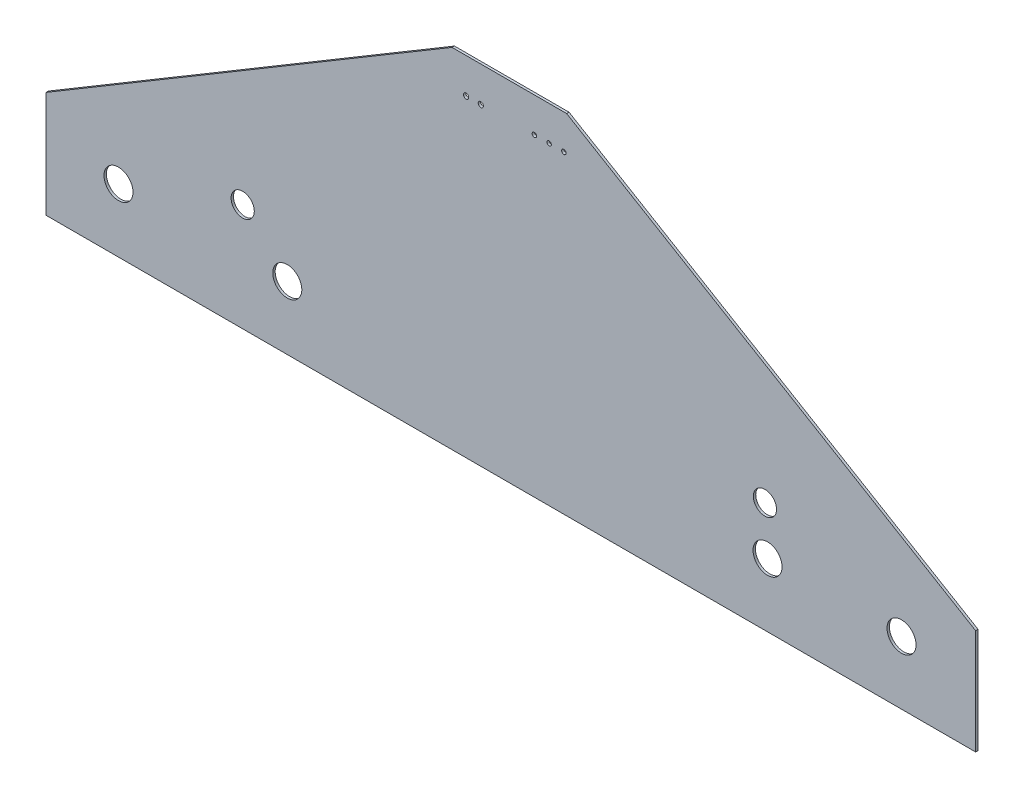
ISO-10303-21;
HEADER;
FILE_DESCRIPTION(('STEP AP214'),'2;1');
FILE_NAME('part.step','',(''),(''),'','','');
FILE_SCHEMA(('AUTOMOTIVE_DESIGN { 1 0 10303 214 1 1 1 1 }'));
ENDSEC;
DATA;
#1=APPLICATION_CONTEXT('core data for automotive mechanical design processes');
#2=APPLICATION_PROTOCOL_DEFINITION('international standard','automotive_design',2000,#1);
#3=PRODUCT_CONTEXT('',#1,'mechanical');
#4=PRODUCT('Part','Part','',(#3));
#5=PRODUCT_RELATED_PRODUCT_CATEGORY('part','',(#4));
#6=PRODUCT_DEFINITION_FORMATION('','',#4);
#7=PRODUCT_DEFINITION_CONTEXT('part definition',#1,'design');
#8=PRODUCT_DEFINITION('design','',#6,#7);
#9=PRODUCT_DEFINITION_SHAPE('','',#8);
#10=(LENGTH_UNIT() NAMED_UNIT(*) SI_UNIT(.MILLI.,.METRE.));
#11=(NAMED_UNIT(*) PLANE_ANGLE_UNIT() SI_UNIT($,.RADIAN.));
#12=(NAMED_UNIT(*) SI_UNIT($,.STERADIAN.) SOLID_ANGLE_UNIT());
#13=UNCERTAINTY_MEASURE_WITH_UNIT(LENGTH_MEASURE(1.E-05),#10,'distance_accuracy_value','');
#14=(GEOMETRIC_REPRESENTATION_CONTEXT(3) GLOBAL_UNCERTAINTY_ASSIGNED_CONTEXT((#13)) GLOBAL_UNIT_ASSIGNED_CONTEXT((#10,
#11,#12)) REPRESENTATION_CONTEXT('',''));
#15=CARTESIAN_POINT('',(0.,0.,0.));
#16=DIRECTION('',(0.,0.,1.));
#17=DIRECTION('',(1.,0.,0.));
#18=AXIS2_PLACEMENT_3D('',#15,#16,#17);
#19=CARTESIAN_POINT('',(0.5999988,0.5999988,0.41148));
#20=DIRECTION('',(0.,0.,1.));
#21=DIRECTION('',(1.,0.,0.));
#22=AXIS2_PLACEMENT_3D('',#19,#20,#21);
#23=PLANE('',#22);
#24=CARTESIAN_POINT('',(87.3409988,54.7019988,0.41148));
#25=DIRECTION('',(0.,0.,-1.));
#26=DIRECTION('',(-1.,0.,0.));
#27=AXIS2_PLACEMENT_3D('',#24,#25,#26);
#28=CIRCLE('',#27,0.381);
#29=CARTESIAN_POINT('',(86.9599988,54.7019988,0.41148));
#30=VERTEX_POINT('',#29);
#31=EDGE_CURVE('E127',#30,#30,#28,.T.);
#32=ORIENTED_EDGE('',*,*,#31,.T.);
#33=EDGE_LOOP('',(#32));
#34=FACE_BOUND('',#33,.T.);
#35=CARTESIAN_POINT('',(89.8809988,54.7019988,0.41148));
#36=DIRECTION('',(0.,0.,-1.));
#37=DIRECTION('',(-1.,0.,0.));
#38=AXIS2_PLACEMENT_3D('',#35,#36,#37);
#39=CIRCLE('',#38,0.381);
#40=CARTESIAN_POINT('',(89.4999988,54.7019988,0.41148));
#41=VERTEX_POINT('',#40);
#42=EDGE_CURVE('E130',#41,#41,#39,.T.);
#43=ORIENTED_EDGE('',*,*,#42,.T.);
#44=EDGE_LOOP('',(#43));
#45=FACE_BOUND('',#44,.T.);
#46=CARTESIAN_POINT('',(84.8009988,54.7019988,0.41148));
#47=DIRECTION('',(0.,0.,-1.));
#48=DIRECTION('',(-1.,0.,0.));
#49=AXIS2_PLACEMENT_3D('',#46,#47,#48);
#50=CIRCLE('',#49,0.381);
#51=CARTESIAN_POINT('',(84.4199988,54.7019988,0.41148));
#52=VERTEX_POINT('',#51);
#53=EDGE_CURVE('E133',#52,#52,#50,.T.);
#54=ORIENTED_EDGE('',*,*,#53,.T.);
#55=EDGE_LOOP('',(#54));
#56=FACE_BOUND('',#55,.T.);
#57=CARTESIAN_POINT('',(124.99999892,11.53999978,0.41148));
#58=DIRECTION('',(0.,0.,-1.));
#59=DIRECTION('',(-1.,0.,0.));
#60=AXIS2_PLACEMENT_3D('',#57,#58,#59);
#61=CIRCLE('',#60,2.50000008);
#62=CARTESIAN_POINT('',(122.49999884,11.53999978,0.41148));
#63=VERTEX_POINT('',#62);
#64=EDGE_CURVE('E136',#63,#63,#61,.T.);
#65=ORIENTED_EDGE('',*,*,#64,.T.);
#66=EDGE_LOOP('',(#65));
#67=FACE_BOUND('',#66,.T.);
#68=CARTESIAN_POINT('',(148.10000098,11.44999996,0.41148));
#69=DIRECTION('',(0.,0.,-1.));
#70=DIRECTION('',(-1.,0.,0.));
#71=AXIS2_PLACEMENT_3D('',#68,#69,#70);
#72=CIRCLE('',#71,2.50000008);
#73=CARTESIAN_POINT('',(145.6000009,11.44999996,0.41148));
#74=VERTEX_POINT('',#73);
#75=EDGE_CURVE('E139',#74,#74,#72,.T.);
#76=ORIENTED_EDGE('',*,*,#75,.T.);
#77=EDGE_LOOP('',(#76));
#78=FACE_BOUND('',#77,.T.);
#79=CARTESIAN_POINT('',(124.5519988,19.6499988,0.41148));
#80=DIRECTION('',(0.,0.,-1.));
#81=DIRECTION('',(-1.,0.,0.));
#82=AXIS2_PLACEMENT_3D('',#79,#80,#81);
#83=CIRCLE('',#82,1.99999854);
#84=CARTESIAN_POINT('',(122.55200026,19.6499988,0.41148));
#85=VERTEX_POINT('',#84);
#86=EDGE_CURVE('E142',#85,#85,#83,.T.);
#87=ORIENTED_EDGE('',*,*,#86,.T.);
#88=EDGE_LOOP('',(#87));
#89=FACE_BOUND('',#88,.T.);
#90=CARTESIAN_POINT('',(73.025,54.61,0.41148));
#91=DIRECTION('',(0.,0.,-1.));
#92=DIRECTION('',(-1.,0.,0.));
#93=AXIS2_PLACEMENT_3D('',#90,#91,#92);
#94=CIRCLE('',#93,0.4499991);
#95=CARTESIAN_POINT('',(72.5750009,54.61,0.41148));
#96=VERTEX_POINT('',#95);
#97=EDGE_CURVE('E145',#96,#96,#94,.T.);
#98=ORIENTED_EDGE('',*,*,#97,.T.);
#99=EDGE_LOOP('',(#98));
#100=FACE_BOUND('',#99,.T.);
#101=CARTESIAN_POINT('',(75.565,54.61,0.41148));
#102=DIRECTION('',(0.,0.,-1.));
#103=DIRECTION('',(-1.,0.,0.));
#104=AXIS2_PLACEMENT_3D('',#101,#102,#103);
#105=CIRCLE('',#104,0.4499991);
#106=CARTESIAN_POINT('',(75.1150009,54.61,0.41148));
#107=VERTEX_POINT('',#106);
#108=EDGE_CURVE('E148',#107,#107,#105,.T.);
#109=ORIENTED_EDGE('',*,*,#108,.T.);
#110=EDGE_LOOP('',(#109));
#111=FACE_BOUND('',#110,.T.);
#112=CARTESIAN_POINT('',(34.5089988,19.1419988,0.41148));
#113=DIRECTION('',(0.,0.,-1.));
#114=DIRECTION('',(-1.,0.,0.));
#115=AXIS2_PLACEMENT_3D('',#112,#113,#114);
#116=CIRCLE('',#115,1.99999854);
#117=CARTESIAN_POINT('',(32.50900026,19.1419988,0.41148));
#118=VERTEX_POINT('',#117);
#119=EDGE_CURVE('E151',#118,#118,#116,.T.);
#120=ORIENTED_EDGE('',*,*,#119,.T.);
#121=EDGE_LOOP('',(#120));
#122=FACE_BOUND('',#121,.T.);
#123=CARTESIAN_POINT('',(42.19999942,11.53999978,0.41148));
#124=DIRECTION('',(0.,0.,-1.));
#125=DIRECTION('',(-1.,0.,0.));
#126=AXIS2_PLACEMENT_3D('',#123,#124,#125);
#127=CIRCLE('',#126,2.50000008);
#128=CARTESIAN_POINT('',(39.69999934,11.53999978,0.41148));
#129=VERTEX_POINT('',#128);
#130=EDGE_CURVE('E153',#129,#129,#127,.T.);
#131=ORIENTED_EDGE('',*,*,#130,.T.);
#132=EDGE_LOOP('',(#131));
#133=FACE_BOUND('',#132,.T.);
#134=CARTESIAN_POINT('',(13.0999992,11.53999978,0.41148));
#135=DIRECTION('',(0.,0.,-1.));
#136=DIRECTION('',(-1.,0.,0.));
#137=AXIS2_PLACEMENT_3D('',#134,#135,#136);
#138=CIRCLE('',#137,2.50000008);
#139=CARTESIAN_POINT('',(10.59999912,11.53999978,0.41148));
#140=VERTEX_POINT('',#139);
#141=EDGE_CURVE('E20',#140,#140,#138,.T.);
#142=ORIENTED_EDGE('',*,*,#141,.T.);
#143=EDGE_LOOP('',(#142));
#144=FACE_BOUND('',#143,.T.);
#145=DIRECTION('',(-0.858999586489203,-0.511976279149121,0.));
#146=VECTOR('',#145,1.);
#147=CARTESIAN_POINT('',(0.60000134,18.94414296,0.41148));
#148=LINE('',#147,#146);
#149=CARTESIAN_POINT('',(0.600001340000001,18.94414296,0.41148));
#150=VERTEX_POINT('',#149);
#151=CARTESIAN_POINT('',(70.6098384599961,60.6710267400066,0.41148));
#152=VERTEX_POINT('',#151);
#153=EDGE_CURVE('E169',#150,#152,#148,.F.);
#154=ORIENTED_EDGE('',*,*,#153,.F.);
#155=DIRECTION('',(-1.38463805007299E-07,-0.99999999999999,0.));
#156=VECTOR('',#155,1.);
#157=CARTESIAN_POINT('',(0.5999988,0.5999988,0.41148));
#158=LINE('',#157,#156);
#159=CARTESIAN_POINT('',(0.599999435000001,0.5999988,0.41148));
#160=VERTEX_POINT('',#159);
#161=EDGE_CURVE('E85',#160,#150,#158,.F.);
#162=ORIENTED_EDGE('',*,*,#161,.F.);
#163=DIRECTION('',(1.,0.,0.));
#164=VECTOR('',#163,1.);
#165=CARTESIAN_POINT('',(160.8739988,0.5999988,0.41148));
#166=LINE('',#165,#164);
#167=CARTESIAN_POINT('',(160.8739988,0.599998799999999,0.41148));
#168=VERTEX_POINT('',#167);
#169=EDGE_CURVE('E81',#168,#160,#166,.F.);
#170=ORIENTED_EDGE('',*,*,#169,.F.);
#171=DIRECTION('',(-1.40170357279899E-07,0.99999999999999,0.));
#172=VECTOR('',#171,1.);
#173=CARTESIAN_POINT('',(160.87399626,18.72080584,0.41148));
#174=LINE('',#173,#172);
#175=CARTESIAN_POINT('',(160.873997529996,18.7208050844236,0.41148));
#176=VERTEX_POINT('',#175);
#177=EDGE_CURVE('E72',#176,#168,#174,.F.);
#178=ORIENTED_EDGE('',*,*,#177,.F.);
#179=DIRECTION('',(-0.85940677887988,0.511292468568929,0.));
#180=VECTOR('',#179,1.);
#181=CARTESIAN_POINT('',(90.36195034,60.67099626,0.41148));
#182=LINE('',#181,#180);
#183=CARTESIAN_POINT('',(90.36195034,60.67099626,0.41148));
#184=VERTEX_POINT('',#183);
#185=EDGE_CURVE('E67',#184,#176,#182,.F.);
#186=ORIENTED_EDGE('',*,*,#185,.F.);
#187=DIRECTION('',(-0.999999999998809,1.54312613175871E-06,0.));
#188=VECTOR('',#187,1.);
#189=CARTESIAN_POINT('',(70.60983846,60.67102674,0.41148));
#190=LINE('',#189,#188);
#191=EDGE_CURVE('E173',#152,#184,#190,.F.);
#192=ORIENTED_EDGE('',*,*,#191,.F.);
#193=EDGE_LOOP('',(#154,#162,#170,#178,#186,#192));
#194=FACE_BOUND('',#193,.T.);
#195=ADVANCED_FACE('F17',(#34,#45,#56,#67,#78,#89,#100,#111,#122,#133,#144,#194),#23,.T.);
#196=CARTESIAN_POINT('',(160.8739988,0.5999988,0.));
#197=DIRECTION('',(0.,-1.,0.));
#198=DIRECTION('',(0.,0.,-1.));
#199=AXIS2_PLACEMENT_3D('',#196,#197,#198);
#200=PLANE('',#199);
#201=DIRECTION('',(0.,0.,1.));
#202=VECTOR('',#201,1.);
#203=CARTESIAN_POINT('',(0.5999988,0.5999988,0.));
#204=LINE('',#203,#202);
#205=CARTESIAN_POINT('',(0.599999435000001,0.5999988,0.));
#206=VERTEX_POINT('',#205);
#207=EDGE_CURVE('E161',#206,#160,#204,.T.);
#208=ORIENTED_EDGE('',*,*,#207,.F.);
#209=DIRECTION('',(1.,0.,0.));
#210=VECTOR('',#209,1.);
#211=CARTESIAN_POINT('',(0.5999988,0.5999988,0.));
#212=LINE('',#211,#210);
#213=CARTESIAN_POINT('',(160.8739988,0.599998799999999,0.));
#214=VERTEX_POINT('',#213);
#215=EDGE_CURVE('E92',#206,#214,#212,.T.);
#216=ORIENTED_EDGE('',*,*,#215,.T.);
#217=DIRECTION('',(0.,0.,1.));
#218=VECTOR('',#217,1.);
#219=CARTESIAN_POINT('',(160.8739988,0.599998799999998,0.));
#220=LINE('',#219,#218);
#221=EDGE_CURVE('E77',#168,#214,#220,.F.);
#222=ORIENTED_EDGE('',*,*,#221,.F.);
#223=ORIENTED_EDGE('',*,*,#169,.T.);
#224=EDGE_LOOP('',(#208,#216,#222,#223));
#225=FACE_BOUND('',#224,.T.);
#226=ADVANCED_FACE('F91',(#225),#200,.T.);
#227=CARTESIAN_POINT('',(160.87399626,18.72080584,0.));
#228=DIRECTION('',(0.99999999999999,1.40170357279899E-07,0.));
#229=DIRECTION('',(-1.40170357279899E-07,0.99999999999999,0.));
#230=AXIS2_PLACEMENT_3D('',#227,#228,#229);
#231=PLANE('',#230);
#232=ORIENTED_EDGE('',*,*,#221,.T.);
#233=DIRECTION('',(0.,1.,0.));
#234=VECTOR('',#233,1.);
#235=CARTESIAN_POINT('',(160.8739988,0.5999988,0.));
#236=LINE('',#235,#234);
#237=CARTESIAN_POINT('',(160.873996894996,18.7208054622083,0.));
#238=VERTEX_POINT('',#237);
#239=EDGE_CURVE('E182',#214,#238,#236,.T.);
#240=ORIENTED_EDGE('',*,*,#239,.T.);
#241=DIRECTION('',(0.,0.,1.));
#242=VECTOR('',#241,1.);
#243=CARTESIAN_POINT('',(160.873996259983,18.7208058399719,0.));
#244=LINE('',#243,#242);
#245=EDGE_CURVE('E79',#176,#238,#244,.F.);
#246=ORIENTED_EDGE('',*,*,#245,.F.);
#247=ORIENTED_EDGE('',*,*,#177,.T.);
#248=EDGE_LOOP('',(#232,#240,#246,#247));
#249=FACE_BOUND('',#248,.T.);
#250=ADVANCED_FACE('F74',(#249),#231,.T.);
#251=CARTESIAN_POINT('',(90.36195034,60.67099626,0.));
#252=DIRECTION('',(0.511292468568929,0.85940677887988,0.));
#253=DIRECTION('',(-0.85940677887988,0.511292468568929,0.));
#254=AXIS2_PLACEMENT_3D('',#251,#252,#253);
#255=PLANE('',#254);
#256=ORIENTED_EDGE('',*,*,#245,.T.);
#257=DIRECTION('',(-0.859406778880083,0.511292468568587,0.));
#258=VECTOR('',#257,1.);
#259=CARTESIAN_POINT('',(160.87399626,18.72080584,0.));
#260=LINE('',#259,#258);
#261=CARTESIAN_POINT('',(90.36195034,60.67099626,0.));
#262=VERTEX_POINT('',#261);
#263=EDGE_CURVE('E177',#238,#262,#260,.T.);
#264=ORIENTED_EDGE('',*,*,#263,.T.);
#265=DIRECTION('',(0.,0.,1.));
#266=VECTOR('',#265,1.);
#267=CARTESIAN_POINT('',(90.36195034,60.67099626,0.));
#268=LINE('',#267,#266);
#269=EDGE_CURVE('E171',#184,#262,#268,.F.);
#270=ORIENTED_EDGE('',*,*,#269,.F.);
#271=ORIENTED_EDGE('',*,*,#185,.T.);
#272=EDGE_LOOP('',(#256,#264,#270,#271));
#273=FACE_BOUND('',#272,.T.);
#274=ADVANCED_FACE('F176',(#273),#255,.T.);
#275=CARTESIAN_POINT('',(70.60983846,60.67102674,0.));
#276=DIRECTION('',(1.54312613175871E-06,0.999999999998809,0.));
#277=DIRECTION('',(-0.999999999998809,1.54312613175871E-06,0.));
#278=AXIS2_PLACEMENT_3D('',#275,#276,#277);
#279=PLANE('',#278);
#280=ORIENTED_EDGE('',*,*,#269,.T.);
#281=DIRECTION('',(-0.99999999999881,1.54312613159079E-06,0.));
#282=VECTOR('',#281,1.);
#283=CARTESIAN_POINT('',(90.36195034,60.67099626,0.));
#284=LINE('',#283,#282);
#285=CARTESIAN_POINT('',(70.6098384599961,60.6710267400066,0.));
#286=VERTEX_POINT('',#285);
#287=EDGE_CURVE('E184',#262,#286,#284,.T.);
#288=ORIENTED_EDGE('',*,*,#287,.T.);
#289=DIRECTION('',(0.,0.,1.));
#290=VECTOR('',#289,1.);
#291=CARTESIAN_POINT('',(70.6098384599843,60.6710267400263,0.));
#292=LINE('',#291,#290);
#293=EDGE_CURVE('E167',#152,#286,#292,.F.);
#294=ORIENTED_EDGE('',*,*,#293,.F.);
#295=ORIENTED_EDGE('',*,*,#191,.T.);
#296=EDGE_LOOP('',(#280,#288,#294,#295));
#297=FACE_BOUND('',#296,.T.);
#298=ADVANCED_FACE('F197',(#297),#279,.T.);
#299=CARTESIAN_POINT('',(0.60000134,18.94414296,0.));
#300=DIRECTION('',(-0.511976279149121,0.858999586489203,0.));
#301=DIRECTION('',(-0.858999586489203,-0.511976279149121,0.));
#302=AXIS2_PLACEMENT_3D('',#299,#300,#301);
#303=PLANE('',#302);
#304=ORIENTED_EDGE('',*,*,#293,.T.);
#305=DIRECTION('',(-0.858999586489395,-0.511976279148799,0.));
#306=VECTOR('',#305,1.);
#307=CARTESIAN_POINT('',(70.60983846,60.67102674,0.));
#308=LINE('',#307,#306);
#309=CARTESIAN_POINT('',(0.60000134,18.94414296,0.));
#310=VERTEX_POINT('',#309);
#311=EDGE_CURVE('E188',#286,#310,#308,.T.);
#312=ORIENTED_EDGE('',*,*,#311,.T.);
#313=DIRECTION('',(0.,0.,1.));
#314=VECTOR('',#313,1.);
#315=CARTESIAN_POINT('',(0.60000134,18.94414296,0.));
#316=LINE('',#315,#314);
#317=EDGE_CURVE('E35',#150,#310,#316,.F.);
#318=ORIENTED_EDGE('',*,*,#317,.F.);
#319=ORIENTED_EDGE('',*,*,#153,.T.);
#320=EDGE_LOOP('',(#304,#312,#318,#319));
#321=FACE_BOUND('',#320,.T.);
#322=ADVANCED_FACE('F193',(#321),#303,.T.);
#323=CARTESIAN_POINT('',(0.5999988,0.5999988,0.));
#324=DIRECTION('',(-0.99999999999999,1.38463805007299E-07,0.));
#325=DIRECTION('',(-1.38463805007299E-07,-0.99999999999999,0.));
#326=AXIS2_PLACEMENT_3D('',#323,#324,#325);
#327=PLANE('',#326);
#328=ORIENTED_EDGE('',*,*,#317,.T.);
#329=DIRECTION('',(0.,1.,0.));
#330=VECTOR('',#329,1.);
#331=CARTESIAN_POINT('',(0.60000134,0.5999988,0.));
#332=LINE('',#331,#330);
#333=EDGE_CURVE('E126',#310,#206,#332,.F.);
#334=ORIENTED_EDGE('',*,*,#333,.T.);
#335=ORIENTED_EDGE('',*,*,#207,.T.);
#336=ORIENTED_EDGE('',*,*,#161,.T.);
#337=EDGE_LOOP('',(#328,#334,#335,#336));
#338=FACE_BOUND('',#337,.T.);
#339=ADVANCED_FACE('F191',(#338),#327,.T.);
#340=CARTESIAN_POINT('',(13.0999992,11.53999978,0.));
#341=DIRECTION('',(0.,0.,-1.));
#342=DIRECTION('',(-1.,0.,0.));
#343=AXIS2_PLACEMENT_3D('',#340,#341,#342);
#344=CYLINDRICAL_SURFACE('',#343,2.50000008);
#345=ORIENTED_EDGE('',*,*,#141,.F.);
#346=EDGE_LOOP('',(#345));
#347=FACE_BOUND('',#346,.T.);
#348=CARTESIAN_POINT('',(13.0999992,11.53999978,0.));
#349=DIRECTION('',(0.,0.,-1.));
#350=DIRECTION('',(-1.,0.,0.));
#351=AXIS2_PLACEMENT_3D('',#348,#349,#350);
#352=CIRCLE('',#351,2.50000008);
#353=CARTESIAN_POINT('',(10.59999912,11.53999978,0.));
#354=VERTEX_POINT('',#353);
#355=EDGE_CURVE('E123',#354,#354,#352,.T.);
#356=ORIENTED_EDGE('',*,*,#355,.T.);
#357=EDGE_LOOP('',(#356));
#358=FACE_BOUND('',#357,.T.);
#359=ADVANCED_FACE('F254',(#347,#358),#344,.F.);
#360=CARTESIAN_POINT('',(42.19999942,11.53999978,0.));
#361=DIRECTION('',(0.,0.,-1.));
#362=DIRECTION('',(-1.,0.,0.));
#363=AXIS2_PLACEMENT_3D('',#360,#361,#362);
#364=CYLINDRICAL_SURFACE('',#363,2.50000008);
#365=ORIENTED_EDGE('',*,*,#130,.F.);
#366=EDGE_LOOP('',(#365));
#367=FACE_BOUND('',#366,.T.);
#368=CARTESIAN_POINT('',(42.19999942,11.53999978,0.));
#369=DIRECTION('',(0.,0.,-1.));
#370=DIRECTION('',(-1.,0.,0.));
#371=AXIS2_PLACEMENT_3D('',#368,#369,#370);
#372=CIRCLE('',#371,2.50000008);
#373=CARTESIAN_POINT('',(39.69999934,11.53999978,0.));
#374=VERTEX_POINT('',#373);
#375=EDGE_CURVE('E120',#374,#374,#372,.T.);
#376=ORIENTED_EDGE('',*,*,#375,.T.);
#377=EDGE_LOOP('',(#376));
#378=FACE_BOUND('',#377,.T.);
#379=ADVANCED_FACE('F250',(#367,#378),#364,.F.);
#380=CARTESIAN_POINT('',(34.5089988,19.1419988,0.));
#381=DIRECTION('',(0.,0.,-1.));
#382=DIRECTION('',(-1.,0.,0.));
#383=AXIS2_PLACEMENT_3D('',#380,#381,#382);
#384=CYLINDRICAL_SURFACE('',#383,1.99999854);
#385=ORIENTED_EDGE('',*,*,#119,.F.);
#386=EDGE_LOOP('',(#385));
#387=FACE_BOUND('',#386,.T.);
#388=CARTESIAN_POINT('',(34.5089988,19.1419988,0.));
#389=DIRECTION('',(0.,0.,-1.));
#390=DIRECTION('',(-1.,0.,0.));
#391=AXIS2_PLACEMENT_3D('',#388,#389,#390);
#392=CIRCLE('',#391,1.99999854);
#393=CARTESIAN_POINT('',(32.50900026,19.1419988,0.));
#394=VERTEX_POINT('',#393);
#395=EDGE_CURVE('E117',#394,#394,#392,.T.);
#396=ORIENTED_EDGE('',*,*,#395,.T.);
#397=EDGE_LOOP('',(#396));
#398=FACE_BOUND('',#397,.T.);
#399=ADVANCED_FACE('F246',(#387,#398),#384,.F.);
#400=CARTESIAN_POINT('',(75.565,54.61,0.));
#401=DIRECTION('',(0.,0.,-1.));
#402=DIRECTION('',(-1.,0.,0.));
#403=AXIS2_PLACEMENT_3D('',#400,#401,#402);
#404=CYLINDRICAL_SURFACE('',#403,0.4499991);
#405=ORIENTED_EDGE('',*,*,#108,.F.);
#406=EDGE_LOOP('',(#405));
#407=FACE_BOUND('',#406,.T.);
#408=CARTESIAN_POINT('',(75.565,54.61,0.));
#409=DIRECTION('',(0.,0.,-1.));
#410=DIRECTION('',(-1.,0.,0.));
#411=AXIS2_PLACEMENT_3D('',#408,#409,#410);
#412=CIRCLE('',#411,0.4499991);
#413=CARTESIAN_POINT('',(75.1150009,54.61,0.));
#414=VERTEX_POINT('',#413);
#415=EDGE_CURVE('E114',#414,#414,#412,.T.);
#416=ORIENTED_EDGE('',*,*,#415,.T.);
#417=EDGE_LOOP('',(#416));
#418=FACE_BOUND('',#417,.T.);
#419=ADVANCED_FACE('F242',(#407,#418),#404,.F.);
#420=CARTESIAN_POINT('',(73.025,54.61,0.));
#421=DIRECTION('',(0.,0.,-1.));
#422=DIRECTION('',(-1.,0.,0.));
#423=AXIS2_PLACEMENT_3D('',#420,#421,#422);
#424=CYLINDRICAL_SURFACE('',#423,0.4499991);
#425=ORIENTED_EDGE('',*,*,#97,.F.);
#426=EDGE_LOOP('',(#425));
#427=FACE_BOUND('',#426,.T.);
#428=CARTESIAN_POINT('',(73.025,54.61,0.));
#429=DIRECTION('',(0.,0.,-1.));
#430=DIRECTION('',(-1.,0.,0.));
#431=AXIS2_PLACEMENT_3D('',#428,#429,#430);
#432=CIRCLE('',#431,0.4499991);
#433=CARTESIAN_POINT('',(72.5750009,54.61,0.));
#434=VERTEX_POINT('',#433);
#435=EDGE_CURVE('E111',#434,#434,#432,.T.);
#436=ORIENTED_EDGE('',*,*,#435,.T.);
#437=EDGE_LOOP('',(#436));
#438=FACE_BOUND('',#437,.T.);
#439=ADVANCED_FACE('F238',(#427,#438),#424,.F.);
#440=CARTESIAN_POINT('',(124.5519988,19.6499988,0.));
#441=DIRECTION('',(0.,0.,-1.));
#442=DIRECTION('',(-1.,0.,0.));
#443=AXIS2_PLACEMENT_3D('',#440,#441,#442);
#444=CYLINDRICAL_SURFACE('',#443,1.99999854);
#445=ORIENTED_EDGE('',*,*,#86,.F.);
#446=EDGE_LOOP('',(#445));
#447=FACE_BOUND('',#446,.T.);
#448=CARTESIAN_POINT('',(124.5519988,19.6499988,0.));
#449=DIRECTION('',(0.,0.,-1.));
#450=DIRECTION('',(-1.,0.,0.));
#451=AXIS2_PLACEMENT_3D('',#448,#449,#450);
#452=CIRCLE('',#451,1.99999854);
#453=CARTESIAN_POINT('',(122.55200026,19.6499988,0.));
#454=VERTEX_POINT('',#453);
#455=EDGE_CURVE('E108',#454,#454,#452,.T.);
#456=ORIENTED_EDGE('',*,*,#455,.T.);
#457=EDGE_LOOP('',(#456));
#458=FACE_BOUND('',#457,.T.);
#459=ADVANCED_FACE('F234',(#447,#458),#444,.F.);
#460=CARTESIAN_POINT('',(148.10000098,11.44999996,0.));
#461=DIRECTION('',(0.,0.,-1.));
#462=DIRECTION('',(-1.,0.,0.));
#463=AXIS2_PLACEMENT_3D('',#460,#461,#462);
#464=CYLINDRICAL_SURFACE('',#463,2.50000008);
#465=ORIENTED_EDGE('',*,*,#75,.F.);
#466=EDGE_LOOP('',(#465));
#467=FACE_BOUND('',#466,.T.);
#468=CARTESIAN_POINT('',(148.10000098,11.44999996,0.));
#469=DIRECTION('',(0.,0.,-1.));
#470=DIRECTION('',(-1.,0.,0.));
#471=AXIS2_PLACEMENT_3D('',#468,#469,#470);
#472=CIRCLE('',#471,2.50000008);
#473=CARTESIAN_POINT('',(145.6000009,11.44999996,0.));
#474=VERTEX_POINT('',#473);
#475=EDGE_CURVE('E105',#474,#474,#472,.T.);
#476=ORIENTED_EDGE('',*,*,#475,.T.);
#477=EDGE_LOOP('',(#476));
#478=FACE_BOUND('',#477,.T.);
#479=ADVANCED_FACE('F230',(#467,#478),#464,.F.);
#480=CARTESIAN_POINT('',(124.99999892,11.53999978,0.));
#481=DIRECTION('',(0.,0.,-1.));
#482=DIRECTION('',(-1.,0.,0.));
#483=AXIS2_PLACEMENT_3D('',#480,#481,#482);
#484=CYLINDRICAL_SURFACE('',#483,2.50000008);
#485=ORIENTED_EDGE('',*,*,#64,.F.);
#486=EDGE_LOOP('',(#485));
#487=FACE_BOUND('',#486,.T.);
#488=CARTESIAN_POINT('',(124.99999892,11.53999978,0.));
#489=DIRECTION('',(0.,0.,-1.));
#490=DIRECTION('',(-1.,0.,0.));
#491=AXIS2_PLACEMENT_3D('',#488,#489,#490);
#492=CIRCLE('',#491,2.50000008);
#493=CARTESIAN_POINT('',(122.49999884,11.53999978,0.));
#494=VERTEX_POINT('',#493);
#495=EDGE_CURVE('E102',#494,#494,#492,.T.);
#496=ORIENTED_EDGE('',*,*,#495,.T.);
#497=EDGE_LOOP('',(#496));
#498=FACE_BOUND('',#497,.T.);
#499=ADVANCED_FACE('F226',(#487,#498),#484,.F.);
#500=CARTESIAN_POINT('',(84.8009988,54.7019988,0.));
#501=DIRECTION('',(0.,0.,-1.));
#502=DIRECTION('',(-1.,0.,0.));
#503=AXIS2_PLACEMENT_3D('',#500,#501,#502);
#504=CYLINDRICAL_SURFACE('',#503,0.381);
#505=ORIENTED_EDGE('',*,*,#53,.F.);
#506=EDGE_LOOP('',(#505));
#507=FACE_BOUND('',#506,.T.);
#508=CARTESIAN_POINT('',(84.8009988,54.7019988,0.));
#509=DIRECTION('',(0.,0.,-1.));
#510=DIRECTION('',(-1.,0.,0.));
#511=AXIS2_PLACEMENT_3D('',#508,#509,#510);
#512=CIRCLE('',#511,0.381);
#513=CARTESIAN_POINT('',(84.4199988,54.7019988,0.));
#514=VERTEX_POINT('',#513);
#515=EDGE_CURVE('E99',#514,#514,#512,.T.);
#516=ORIENTED_EDGE('',*,*,#515,.T.);
#517=EDGE_LOOP('',(#516));
#518=FACE_BOUND('',#517,.T.);
#519=ADVANCED_FACE('F222',(#507,#518),#504,.F.);
#520=CARTESIAN_POINT('',(89.8809988,54.7019988,0.));
#521=DIRECTION('',(0.,0.,-1.));
#522=DIRECTION('',(-1.,0.,0.));
#523=AXIS2_PLACEMENT_3D('',#520,#521,#522);
#524=CYLINDRICAL_SURFACE('',#523,0.381);
#525=ORIENTED_EDGE('',*,*,#42,.F.);
#526=EDGE_LOOP('',(#525));
#527=FACE_BOUND('',#526,.T.);
#528=CARTESIAN_POINT('',(89.8809988,54.7019988,0.));
#529=DIRECTION('',(0.,0.,-1.));
#530=DIRECTION('',(-1.,0.,0.));
#531=AXIS2_PLACEMENT_3D('',#528,#529,#530);
#532=CIRCLE('',#531,0.381);
#533=CARTESIAN_POINT('',(89.4999988,54.7019988,0.));
#534=VERTEX_POINT('',#533);
#535=EDGE_CURVE('E26',#534,#534,#532,.T.);
#536=ORIENTED_EDGE('',*,*,#535,.T.);
#537=EDGE_LOOP('',(#536));
#538=FACE_BOUND('',#537,.T.);
#539=ADVANCED_FACE('F214',(#527,#538),#524,.F.);
#540=CARTESIAN_POINT('',(87.3409988,54.7019988,0.));
#541=DIRECTION('',(0.,0.,-1.));
#542=DIRECTION('',(-1.,0.,0.));
#543=AXIS2_PLACEMENT_3D('',#540,#541,#542);
#544=CYLINDRICAL_SURFACE('',#543,0.381);
#545=ORIENTED_EDGE('',*,*,#31,.F.);
#546=EDGE_LOOP('',(#545));
#547=FACE_BOUND('',#546,.T.);
#548=CARTESIAN_POINT('',(87.3409988,54.7019988,0.));
#549=DIRECTION('',(0.,0.,-1.));
#550=DIRECTION('',(-1.,0.,0.));
#551=AXIS2_PLACEMENT_3D('',#548,#549,#550);
#552=CIRCLE('',#551,0.381);
#553=CARTESIAN_POINT('',(86.9599988,54.7019988,0.));
#554=VERTEX_POINT('',#553);
#555=EDGE_CURVE('E11',#554,#554,#552,.T.);
#556=ORIENTED_EDGE('',*,*,#555,.T.);
#557=EDGE_LOOP('',(#556));
#558=FACE_BOUND('',#557,.T.);
#559=ADVANCED_FACE('F208',(#547,#558),#544,.F.);
#560=CARTESIAN_POINT('',(0.5999988,0.5999988,0.));
#561=DIRECTION('',(0.,0.,1.));
#562=DIRECTION('',(1.,0.,0.));
#563=AXIS2_PLACEMENT_3D('',#560,#561,#562);
#564=PLANE('',#563);
#565=ORIENTED_EDGE('',*,*,#555,.F.);
#566=EDGE_LOOP('',(#565));
#567=FACE_BOUND('',#566,.T.);
#568=ORIENTED_EDGE('',*,*,#535,.F.);
#569=EDGE_LOOP('',(#568));
#570=FACE_BOUND('',#569,.T.);
#571=ORIENTED_EDGE('',*,*,#515,.F.);
#572=EDGE_LOOP('',(#571));
#573=FACE_BOUND('',#572,.T.);
#574=ORIENTED_EDGE('',*,*,#495,.F.);
#575=EDGE_LOOP('',(#574));
#576=FACE_BOUND('',#575,.T.);
#577=ORIENTED_EDGE('',*,*,#475,.F.);
#578=EDGE_LOOP('',(#577));
#579=FACE_BOUND('',#578,.T.);
#580=ORIENTED_EDGE('',*,*,#455,.F.);
#581=EDGE_LOOP('',(#580));
#582=FACE_BOUND('',#581,.T.);
#583=ORIENTED_EDGE('',*,*,#435,.F.);
#584=EDGE_LOOP('',(#583));
#585=FACE_BOUND('',#584,.T.);
#586=ORIENTED_EDGE('',*,*,#415,.F.);
#587=EDGE_LOOP('',(#586));
#588=FACE_BOUND('',#587,.T.);
#589=ORIENTED_EDGE('',*,*,#395,.F.);
#590=EDGE_LOOP('',(#589));
#591=FACE_BOUND('',#590,.T.);
#592=ORIENTED_EDGE('',*,*,#375,.F.);
#593=EDGE_LOOP('',(#592));
#594=FACE_BOUND('',#593,.T.);
#595=ORIENTED_EDGE('',*,*,#355,.F.);
#596=EDGE_LOOP('',(#595));
#597=FACE_BOUND('',#596,.T.);
#598=ORIENTED_EDGE('',*,*,#311,.F.);
#599=ORIENTED_EDGE('',*,*,#287,.F.);
#600=ORIENTED_EDGE('',*,*,#263,.F.);
#601=ORIENTED_EDGE('',*,*,#239,.F.);
#602=ORIENTED_EDGE('',*,*,#215,.F.);
#603=ORIENTED_EDGE('',*,*,#333,.F.);
#604=EDGE_LOOP('',(#598,#599,#600,#601,#602,#603));
#605=FACE_BOUND('',#604,.T.);
#606=ADVANCED_FACE('F181',(#567,#570,#573,#576,#579,#582,#585,#588,#591,#594,#597,#605),#564,.F.);
#607=CLOSED_SHELL('',(#195,#226,#250,#274,#298,#322,#339,#359,#379,#399,#419,#439,#459,#479,
#499,#519,#539,#559,#606));
#608=MANIFOLD_SOLID_BREP('B1',#607);
#609=ADVANCED_BREP_SHAPE_REPRESENTATION('',(#18,#608),#14);
#610=SHAPE_DEFINITION_REPRESENTATION(#9,#609);
ENDSEC;
END-ISO-10303-21;
